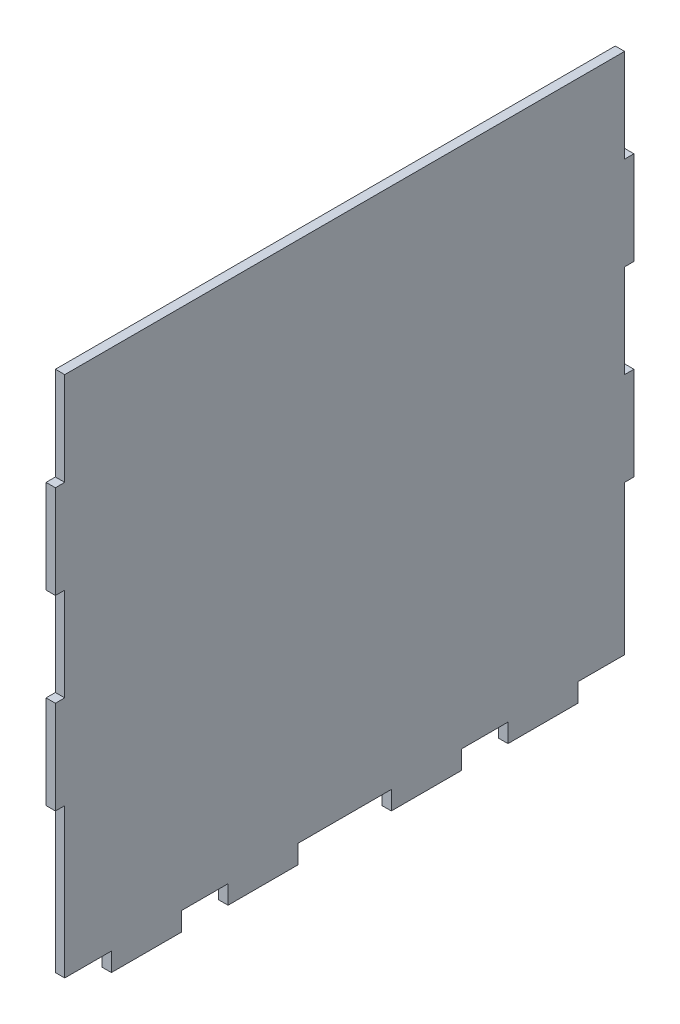
ISO-10303-21;
HEADER;
FILE_DESCRIPTION(('STEP AP214'),'2;1');
FILE_NAME('part.step','',(''),(''),'','','');
FILE_SCHEMA(('AUTOMOTIVE_DESIGN { 1 0 10303 214 1 1 1 1 }'));
ENDSEC;
DATA;
#1=APPLICATION_CONTEXT('core data for automotive mechanical design processes');
#2=APPLICATION_PROTOCOL_DEFINITION('international standard','automotive_design',2000,#1);
#3=PRODUCT_CONTEXT('',#1,'mechanical');
#4=PRODUCT('Part','Part','',(#3));
#5=PRODUCT_RELATED_PRODUCT_CATEGORY('part','',(#4));
#6=PRODUCT_DEFINITION_FORMATION('','',#4);
#7=PRODUCT_DEFINITION_CONTEXT('part definition',#1,'design');
#8=PRODUCT_DEFINITION('design','',#6,#7);
#9=PRODUCT_DEFINITION_SHAPE('','',#8);
#10=(LENGTH_UNIT() NAMED_UNIT(*) SI_UNIT(.MILLI.,.METRE.));
#11=(NAMED_UNIT(*) PLANE_ANGLE_UNIT() SI_UNIT($,.RADIAN.));
#12=(NAMED_UNIT(*) SI_UNIT($,.STERADIAN.) SOLID_ANGLE_UNIT());
#13=UNCERTAINTY_MEASURE_WITH_UNIT(LENGTH_MEASURE(1.E-05),#10,'distance_accuracy_value','');
#14=(GEOMETRIC_REPRESENTATION_CONTEXT(3) GLOBAL_UNCERTAINTY_ASSIGNED_CONTEXT((#13)) GLOBAL_UNIT_ASSIGNED_CONTEXT((#10,
#11,#12)) REPRESENTATION_CONTEXT('',''));
#15=CARTESIAN_POINT('',(0.,0.,0.));
#16=DIRECTION('',(0.,0.,1.));
#17=DIRECTION('',(1.,0.,0.));
#18=AXIS2_PLACEMENT_3D('',#15,#16,#17);
#19=CARTESIAN_POINT('',(2.,36.,-60.));
#20=DIRECTION('',(0.,0.,1.));
#21=DIRECTION('',(1.,0.,0.));
#22=AXIS2_PLACEMENT_3D('',#19,#20,#21);
#23=PLANE('',#22);
#24=DIRECTION('',(0.,1.,0.));
#25=VECTOR('',#24,1.);
#26=CARTESIAN_POINT('',(0.,36.,-60.));
#27=LINE('',#26,#25);
#28=CARTESIAN_POINT('',(0.,36.,-60.));
#29=VERTEX_POINT('',#28);
#30=CARTESIAN_POINT('',(0.,56.,-60.));
#31=VERTEX_POINT('',#30);
#32=EDGE_CURVE('E297',#29,#31,#27,.T.);
#33=ORIENTED_EDGE('',*,*,#32,.T.);
#34=DIRECTION('',(-1.,0.,0.));
#35=VECTOR('',#34,1.);
#36=CARTESIAN_POINT('',(2.,56.,-60.));
#37=LINE('',#36,#35);
#38=CARTESIAN_POINT('',(2.,56.,-60.));
#39=VERTEX_POINT('',#38);
#40=EDGE_CURVE('E11',#39,#31,#37,.T.);
#41=ORIENTED_EDGE('',*,*,#40,.F.);
#42=DIRECTION('',(0.,1.,0.));
#43=VECTOR('',#42,1.);
#44=CARTESIAN_POINT('',(2.,36.,-60.));
#45=LINE('',#44,#43);
#46=CARTESIAN_POINT('',(2.,36.,-60.));
#47=VERTEX_POINT('',#46);
#48=EDGE_CURVE('E367',#47,#39,#45,.T.);
#49=ORIENTED_EDGE('',*,*,#48,.F.);
#50=DIRECTION('',(-1.,0.,0.));
#51=VECTOR('',#50,1.);
#52=CARTESIAN_POINT('',(2.,36.,-60.));
#53=LINE('',#52,#51);
#54=EDGE_CURVE('E293',#47,#29,#53,.T.);
#55=ORIENTED_EDGE('',*,*,#54,.T.);
#56=EDGE_LOOP('',(#33,#41,#49,#55));
#57=FACE_BOUND('',#56,.T.);
#58=ADVANCED_FACE('F33',(#57),#23,.F.);
#59=CARTESIAN_POINT('',(2.,56.,60.));
#60=DIRECTION('',(0.,-1.,0.));
#61=DIRECTION('',(0.,0.,-1.));
#62=AXIS2_PLACEMENT_3D('',#59,#60,#61);
#63=PLANE('',#62);
#64=DIRECTION('',(0.,0.,1.));
#65=VECTOR('',#64,1.);
#66=CARTESIAN_POINT('',(0.,56.,60.));
#67=LINE('',#66,#65);
#68=CARTESIAN_POINT('',(0.,56.,60.));
#69=VERTEX_POINT('',#68);
#70=EDGE_CURVE('E300',#31,#69,#67,.T.);
#71=ORIENTED_EDGE('',*,*,#70,.T.);
#72=DIRECTION('',(-1.,0.,0.));
#73=VECTOR('',#72,1.);
#74=CARTESIAN_POINT('',(2.,56.,60.));
#75=LINE('',#74,#73);
#76=CARTESIAN_POINT('',(2.,56.,60.));
#77=VERTEX_POINT('',#76);
#78=EDGE_CURVE('E41',#77,#69,#75,.T.);
#79=ORIENTED_EDGE('',*,*,#78,.F.);
#80=DIRECTION('',(0.,0.,1.));
#81=VECTOR('',#80,1.);
#82=CARTESIAN_POINT('',(2.,56.,60.));
#83=LINE('',#82,#81);
#84=EDGE_CURVE('E176',#39,#77,#83,.T.);
#85=ORIENTED_EDGE('',*,*,#84,.F.);
#86=ORIENTED_EDGE('',*,*,#40,.T.);
#87=EDGE_LOOP('',(#71,#79,#85,#86));
#88=FACE_BOUND('',#87,.T.);
#89=ADVANCED_FACE('F565',(#88),#63,.F.);
#90=CARTESIAN_POINT('',(2.,36.,60.));
#91=DIRECTION('',(0.,0.,-1.));
#92=DIRECTION('',(-1.,0.,0.));
#93=AXIS2_PLACEMENT_3D('',#90,#91,#92);
#94=PLANE('',#93);
#95=DIRECTION('',(0.,-1.,0.));
#96=VECTOR('',#95,1.);
#97=CARTESIAN_POINT('',(0.,36.,60.));
#98=LINE('',#97,#96);
#99=CARTESIAN_POINT('',(0.,36.,60.));
#100=VERTEX_POINT('',#99);
#101=EDGE_CURVE('E302',#69,#100,#98,.T.);
#102=ORIENTED_EDGE('',*,*,#101,.T.);
#103=DIRECTION('',(-1.,0.,0.));
#104=VECTOR('',#103,1.);
#105=CARTESIAN_POINT('',(2.,36.,60.));
#106=LINE('',#105,#104);
#107=CARTESIAN_POINT('',(2.,36.,60.));
#108=VERTEX_POINT('',#107);
#109=EDGE_CURVE('E458',#108,#100,#106,.T.);
#110=ORIENTED_EDGE('',*,*,#109,.F.);
#111=DIRECTION('',(0.,-1.,0.));
#112=VECTOR('',#111,1.);
#113=CARTESIAN_POINT('',(2.,36.,60.));
#114=LINE('',#113,#112);
#115=EDGE_CURVE('E466',#77,#108,#114,.T.);
#116=ORIENTED_EDGE('',*,*,#115,.F.);
#117=ORIENTED_EDGE('',*,*,#78,.T.);
#118=EDGE_LOOP('',(#102,#110,#116,#117));
#119=FACE_BOUND('',#118,.T.);
#120=ADVANCED_FACE('F464',(#119),#94,.F.);
#121=CARTESIAN_POINT('',(2.,36.,60.));
#122=DIRECTION('',(0.,-1.,0.));
#123=DIRECTION('',(0.,0.,-1.));
#124=AXIS2_PLACEMENT_3D('',#121,#122,#123);
#125=PLANE('',#124);
#126=DIRECTION('',(0.,0.,1.));
#127=VECTOR('',#126,1.);
#128=CARTESIAN_POINT('',(0.,36.,60.));
#129=LINE('',#128,#127);
#130=CARTESIAN_POINT('',(0.,36.,62.));
#131=VERTEX_POINT('',#130);
#132=EDGE_CURVE('E304',#100,#131,#129,.T.);
#133=ORIENTED_EDGE('',*,*,#132,.T.);
#134=DIRECTION('',(-1.,0.,0.));
#135=VECTOR('',#134,1.);
#136=CARTESIAN_POINT('',(2.,36.,62.));
#137=LINE('',#136,#135);
#138=CARTESIAN_POINT('',(2.,36.,62.));
#139=VERTEX_POINT('',#138);
#140=EDGE_CURVE('E455',#139,#131,#137,.T.);
#141=ORIENTED_EDGE('',*,*,#140,.F.);
#142=DIRECTION('',(0.,0.,1.));
#143=VECTOR('',#142,1.);
#144=CARTESIAN_POINT('',(2.,36.,60.));
#145=LINE('',#144,#143);
#146=EDGE_CURVE('E484',#108,#139,#145,.T.);
#147=ORIENTED_EDGE('',*,*,#146,.F.);
#148=ORIENTED_EDGE('',*,*,#109,.T.);
#149=EDGE_LOOP('',(#133,#141,#147,#148));
#150=FACE_BOUND('',#149,.T.);
#151=ADVANCED_FACE('F475',(#150),#125,.F.);
#152=CARTESIAN_POINT('',(2.,36.,62.));
#153=DIRECTION('',(0.,0.,-1.));
#154=DIRECTION('',(-1.,0.,0.));
#155=AXIS2_PLACEMENT_3D('',#152,#153,#154);
#156=PLANE('',#155);
#157=DIRECTION('',(0.,-1.,0.));
#158=VECTOR('',#157,1.);
#159=CARTESIAN_POINT('',(0.,36.,62.));
#160=LINE('',#159,#158);
#161=CARTESIAN_POINT('',(0.,16.,62.));
#162=VERTEX_POINT('',#161);
#163=EDGE_CURVE('E306',#131,#162,#160,.T.);
#164=ORIENTED_EDGE('',*,*,#163,.T.);
#165=DIRECTION('',(-1.,0.,0.));
#166=VECTOR('',#165,1.);
#167=CARTESIAN_POINT('',(2.,16.,62.));
#168=LINE('',#167,#166);
#169=CARTESIAN_POINT('',(2.,16.,62.));
#170=VERTEX_POINT('',#169);
#171=EDGE_CURVE('E452',#170,#162,#168,.T.);
#172=ORIENTED_EDGE('',*,*,#171,.F.);
#173=DIRECTION('',(0.,-1.,0.));
#174=VECTOR('',#173,1.);
#175=CARTESIAN_POINT('',(2.,36.,62.));
#176=LINE('',#175,#174);
#177=EDGE_CURVE('E481',#139,#170,#176,.T.);
#178=ORIENTED_EDGE('',*,*,#177,.F.);
#179=ORIENTED_EDGE('',*,*,#140,.T.);
#180=EDGE_LOOP('',(#164,#172,#178,#179));
#181=FACE_BOUND('',#180,.T.);
#182=ADVANCED_FACE('F479',(#181),#156,.F.);
#183=CARTESIAN_POINT('',(2.,16.,60.));
#184=DIRECTION('',(0.,1.,0.));
#185=DIRECTION('',(0.,0.,1.));
#186=AXIS2_PLACEMENT_3D('',#183,#184,#185);
#187=PLANE('',#186);
#188=DIRECTION('',(0.,0.,-1.));
#189=VECTOR('',#188,1.);
#190=CARTESIAN_POINT('',(0.,16.,60.));
#191=LINE('',#190,#189);
#192=CARTESIAN_POINT('',(0.,16.,60.));
#193=VERTEX_POINT('',#192);
#194=EDGE_CURVE('E308',#162,#193,#191,.T.);
#195=ORIENTED_EDGE('',*,*,#194,.T.);
#196=DIRECTION('',(-1.,0.,0.));
#197=VECTOR('',#196,1.);
#198=CARTESIAN_POINT('',(2.,16.,60.));
#199=LINE('',#198,#197);
#200=CARTESIAN_POINT('',(2.,16.,60.));
#201=VERTEX_POINT('',#200);
#202=EDGE_CURVE('E449',#201,#193,#199,.T.);
#203=ORIENTED_EDGE('',*,*,#202,.F.);
#204=DIRECTION('',(0.,0.,-1.));
#205=VECTOR('',#204,1.);
#206=CARTESIAN_POINT('',(2.,16.,60.));
#207=LINE('',#206,#205);
#208=EDGE_CURVE('E483',#170,#201,#207,.T.);
#209=ORIENTED_EDGE('',*,*,#208,.F.);
#210=ORIENTED_EDGE('',*,*,#171,.T.);
#211=EDGE_LOOP('',(#195,#203,#209,#210));
#212=FACE_BOUND('',#211,.T.);
#213=ADVANCED_FACE('F578',(#212),#187,.F.);
#214=CARTESIAN_POINT('',(2.,-4.,60.));
#215=DIRECTION('',(0.,0.,-1.));
#216=DIRECTION('',(-1.,0.,0.));
#217=AXIS2_PLACEMENT_3D('',#214,#215,#216);
#218=PLANE('',#217);
#219=DIRECTION('',(0.,-1.,0.));
#220=VECTOR('',#219,1.);
#221=CARTESIAN_POINT('',(0.,-4.,60.));
#222=LINE('',#221,#220);
#223=CARTESIAN_POINT('',(0.,-4.,60.));
#224=VERTEX_POINT('',#223);
#225=EDGE_CURVE('E310',#193,#224,#222,.T.);
#226=ORIENTED_EDGE('',*,*,#225,.T.);
#227=DIRECTION('',(-1.,0.,0.));
#228=VECTOR('',#227,1.);
#229=CARTESIAN_POINT('',(2.,-4.,60.));
#230=LINE('',#229,#228);
#231=CARTESIAN_POINT('',(2.,-4.,60.));
#232=VERTEX_POINT('',#231);
#233=EDGE_CURVE('E446',#232,#224,#230,.T.);
#234=ORIENTED_EDGE('',*,*,#233,.F.);
#235=DIRECTION('',(0.,-1.,0.));
#236=VECTOR('',#235,1.);
#237=CARTESIAN_POINT('',(2.,-4.,60.));
#238=LINE('',#237,#236);
#239=EDGE_CURVE('E486',#201,#232,#238,.T.);
#240=ORIENTED_EDGE('',*,*,#239,.F.);
#241=ORIENTED_EDGE('',*,*,#202,.T.);
#242=EDGE_LOOP('',(#226,#234,#240,#241));
#243=FACE_BOUND('',#242,.T.);
#244=ADVANCED_FACE('F581',(#243),#218,.F.);
#245=CARTESIAN_POINT('',(2.,-4.,60.));
#246=DIRECTION('',(0.,-1.,0.));
#247=DIRECTION('',(0.,0.,-1.));
#248=AXIS2_PLACEMENT_3D('',#245,#246,#247);
#249=PLANE('',#248);
#250=DIRECTION('',(0.,0.,1.));
#251=VECTOR('',#250,1.);
#252=CARTESIAN_POINT('',(0.,-4.,60.));
#253=LINE('',#252,#251);
#254=CARTESIAN_POINT('',(0.,-4.,62.));
#255=VERTEX_POINT('',#254);
#256=EDGE_CURVE('E312',#224,#255,#253,.T.);
#257=ORIENTED_EDGE('',*,*,#256,.T.);
#258=DIRECTION('',(-1.,0.,0.));
#259=VECTOR('',#258,1.);
#260=CARTESIAN_POINT('',(2.,-4.,62.));
#261=LINE('',#260,#259);
#262=CARTESIAN_POINT('',(2.,-4.,62.));
#263=VERTEX_POINT('',#262);
#264=EDGE_CURVE('E443',#263,#255,#261,.T.);
#265=ORIENTED_EDGE('',*,*,#264,.F.);
#266=DIRECTION('',(0.,0.,1.));
#267=VECTOR('',#266,1.);
#268=CARTESIAN_POINT('',(2.,-4.,60.));
#269=LINE('',#268,#267);
#270=EDGE_CURVE('E492',#232,#263,#269,.T.);
#271=ORIENTED_EDGE('',*,*,#270,.F.);
#272=ORIENTED_EDGE('',*,*,#233,.T.);
#273=EDGE_LOOP('',(#257,#265,#271,#272));
#274=FACE_BOUND('',#273,.T.);
#275=ADVANCED_FACE('F585',(#274),#249,.F.);
#276=CARTESIAN_POINT('',(2.,-4.,62.));
#277=DIRECTION('',(0.,0.,-1.));
#278=DIRECTION('',(0.,1.,0.));
#279=AXIS2_PLACEMENT_3D('',#276,#277,#278);
#280=PLANE('',#279);
#281=DIRECTION('',(0.,-1.,0.));
#282=VECTOR('',#281,1.);
#283=CARTESIAN_POINT('',(0.,-4.,62.));
#284=LINE('',#283,#282);
#285=CARTESIAN_POINT('',(0.,-24.,62.));
#286=VERTEX_POINT('',#285);
#287=EDGE_CURVE('E314',#255,#286,#284,.T.);
#288=ORIENTED_EDGE('',*,*,#287,.T.);
#289=DIRECTION('',(-1.,0.,0.));
#290=VECTOR('',#289,1.);
#291=CARTESIAN_POINT('',(2.,-24.,62.));
#292=LINE('',#291,#290);
#293=CARTESIAN_POINT('',(2.,-24.,62.));
#294=VERTEX_POINT('',#293);
#295=EDGE_CURVE('E440',#294,#286,#292,.T.);
#296=ORIENTED_EDGE('',*,*,#295,.F.);
#297=DIRECTION('',(0.,-1.,0.));
#298=VECTOR('',#297,1.);
#299=CARTESIAN_POINT('',(2.,-4.,62.));
#300=LINE('',#299,#298);
#301=EDGE_CURVE('E494',#263,#294,#300,.T.);
#302=ORIENTED_EDGE('',*,*,#301,.F.);
#303=ORIENTED_EDGE('',*,*,#264,.T.);
#304=EDGE_LOOP('',(#288,#296,#302,#303));
#305=FACE_BOUND('',#304,.T.);
#306=ADVANCED_FACE('F589',(#305),#280,.F.);
#307=CARTESIAN_POINT('',(2.,-24.,60.));
#308=DIRECTION('',(0.,1.,0.));
#309=DIRECTION('',(0.,0.,1.));
#310=AXIS2_PLACEMENT_3D('',#307,#308,#309);
#311=PLANE('',#310);
#312=DIRECTION('',(0.,0.,-1.));
#313=VECTOR('',#312,1.);
#314=CARTESIAN_POINT('',(0.,-24.,60.));
#315=LINE('',#314,#313);
#316=CARTESIAN_POINT('',(0.,-24.,60.));
#317=VERTEX_POINT('',#316);
#318=EDGE_CURVE('E316',#286,#317,#315,.T.);
#319=ORIENTED_EDGE('',*,*,#318,.T.);
#320=DIRECTION('',(-1.,0.,0.));
#321=VECTOR('',#320,1.);
#322=CARTESIAN_POINT('',(2.,-24.,60.));
#323=LINE('',#322,#321);
#324=CARTESIAN_POINT('',(2.,-24.,60.));
#325=VERTEX_POINT('',#324);
#326=EDGE_CURVE('E437',#325,#317,#323,.T.);
#327=ORIENTED_EDGE('',*,*,#326,.F.);
#328=DIRECTION('',(0.,0.,-1.));
#329=VECTOR('',#328,1.);
#330=CARTESIAN_POINT('',(2.,-24.,60.));
#331=LINE('',#330,#329);
#332=EDGE_CURVE('E496',#294,#325,#331,.T.);
#333=ORIENTED_EDGE('',*,*,#332,.F.);
#334=ORIENTED_EDGE('',*,*,#295,.T.);
#335=EDGE_LOOP('',(#319,#327,#333,#334));
#336=FACE_BOUND('',#335,.T.);
#337=ADVANCED_FACE('F593',(#336),#311,.F.);
#338=CARTESIAN_POINT('',(2.,-56.,60.));
#339=DIRECTION('',(0.,0.,-1.));
#340=DIRECTION('',(-1.,0.,0.));
#341=AXIS2_PLACEMENT_3D('',#338,#339,#340);
#342=PLANE('',#341);
#343=DIRECTION('',(0.,-1.,0.));
#344=VECTOR('',#343,1.);
#345=CARTESIAN_POINT('',(0.,-56.,60.));
#346=LINE('',#345,#344);
#347=CARTESIAN_POINT('',(0.,-56.,60.));
#348=VERTEX_POINT('',#347);
#349=EDGE_CURVE('E318',#317,#348,#346,.T.);
#350=ORIENTED_EDGE('',*,*,#349,.T.);
#351=DIRECTION('',(-1.,0.,0.));
#352=VECTOR('',#351,1.);
#353=CARTESIAN_POINT('',(2.,-56.,60.));
#354=LINE('',#353,#352);
#355=CARTESIAN_POINT('',(2.,-56.,60.));
#356=VERTEX_POINT('',#355);
#357=EDGE_CURVE('E434',#356,#348,#354,.T.);
#358=ORIENTED_EDGE('',*,*,#357,.F.);
#359=DIRECTION('',(0.,-1.,0.));
#360=VECTOR('',#359,1.);
#361=CARTESIAN_POINT('',(2.,-56.,60.));
#362=LINE('',#361,#360);
#363=EDGE_CURVE('E498',#325,#356,#362,.T.);
#364=ORIENTED_EDGE('',*,*,#363,.F.);
#365=ORIENTED_EDGE('',*,*,#326,.T.);
#366=EDGE_LOOP('',(#350,#358,#364,#365));
#367=FACE_BOUND('',#366,.T.);
#368=ADVANCED_FACE('F597',(#367),#342,.F.);
#369=CARTESIAN_POINT('',(2.,-56.,60.));
#370=DIRECTION('',(0.,1.,0.));
#371=DIRECTION('',(0.,0.,1.));
#372=AXIS2_PLACEMENT_3D('',#369,#370,#371);
#373=PLANE('',#372);
#374=DIRECTION('',(0.,0.,-1.));
#375=VECTOR('',#374,1.);
#376=CARTESIAN_POINT('',(0.,-56.,60.));
#377=LINE('',#376,#375);
#378=CARTESIAN_POINT('',(0.,-56.,50.));
#379=VERTEX_POINT('',#378);
#380=EDGE_CURVE('E320',#348,#379,#377,.T.);
#381=ORIENTED_EDGE('',*,*,#380,.T.);
#382=DIRECTION('',(-1.,0.,0.));
#383=VECTOR('',#382,1.);
#384=CARTESIAN_POINT('',(2.,-56.,50.));
#385=LINE('',#384,#383);
#386=CARTESIAN_POINT('',(2.,-56.,50.));
#387=VERTEX_POINT('',#386);
#388=EDGE_CURVE('E431',#387,#379,#385,.T.);
#389=ORIENTED_EDGE('',*,*,#388,.F.);
#390=DIRECTION('',(0.,0.,-1.));
#391=VECTOR('',#390,1.);
#392=CARTESIAN_POINT('',(2.,-56.,60.));
#393=LINE('',#392,#391);
#394=EDGE_CURVE('E500',#356,#387,#393,.T.);
#395=ORIENTED_EDGE('',*,*,#394,.F.);
#396=ORIENTED_EDGE('',*,*,#357,.T.);
#397=EDGE_LOOP('',(#381,#389,#395,#396));
#398=FACE_BOUND('',#397,.T.);
#399=ADVANCED_FACE('F601',(#398),#373,.F.);
#400=CARTESIAN_POINT('',(2.,-56.,50.));
#401=DIRECTION('',(0.,0.,-1.));
#402=DIRECTION('',(-1.,0.,0.));
#403=AXIS2_PLACEMENT_3D('',#400,#401,#402);
#404=PLANE('',#403);
#405=DIRECTION('',(0.,-1.,0.));
#406=VECTOR('',#405,1.);
#407=CARTESIAN_POINT('',(0.,-56.,50.));
#408=LINE('',#407,#406);
#409=CARTESIAN_POINT('',(0.,-60.,50.));
#410=VERTEX_POINT('',#409);
#411=EDGE_CURVE('E322',#379,#410,#408,.T.);
#412=ORIENTED_EDGE('',*,*,#411,.T.);
#413=DIRECTION('',(-1.,0.,0.));
#414=VECTOR('',#413,1.);
#415=CARTESIAN_POINT('',(2.,-60.,50.));
#416=LINE('',#415,#414);
#417=CARTESIAN_POINT('',(2.,-60.,50.));
#418=VERTEX_POINT('',#417);
#419=EDGE_CURVE('E428',#418,#410,#416,.T.);
#420=ORIENTED_EDGE('',*,*,#419,.F.);
#421=DIRECTION('',(0.,-1.,0.));
#422=VECTOR('',#421,1.);
#423=CARTESIAN_POINT('',(2.,-56.,50.));
#424=LINE('',#423,#422);
#425=EDGE_CURVE('E502',#387,#418,#424,.T.);
#426=ORIENTED_EDGE('',*,*,#425,.F.);
#427=ORIENTED_EDGE('',*,*,#388,.T.);
#428=EDGE_LOOP('',(#412,#420,#426,#427));
#429=FACE_BOUND('',#428,.T.);
#430=ADVANCED_FACE('F605',(#429),#404,.F.);
#431=CARTESIAN_POINT('',(2.,-60.,50.));
#432=DIRECTION('',(0.,1.,0.));
#433=DIRECTION('',(0.,0.,1.));
#434=AXIS2_PLACEMENT_3D('',#431,#432,#433);
#435=PLANE('',#434);
#436=DIRECTION('',(0.,0.,-1.));
#437=VECTOR('',#436,1.);
#438=CARTESIAN_POINT('',(0.,-60.,50.));
#439=LINE('',#438,#437);
#440=CARTESIAN_POINT('',(0.,-60.,35.));
#441=VERTEX_POINT('',#440);
#442=EDGE_CURVE('E324',#410,#441,#439,.T.);
#443=ORIENTED_EDGE('',*,*,#442,.T.);
#444=DIRECTION('',(-1.,0.,0.));
#445=VECTOR('',#444,1.);
#446=CARTESIAN_POINT('',(2.,-60.,35.));
#447=LINE('',#446,#445);
#448=CARTESIAN_POINT('',(2.,-60.,35.));
#449=VERTEX_POINT('',#448);
#450=EDGE_CURVE('E425',#449,#441,#447,.T.);
#451=ORIENTED_EDGE('',*,*,#450,.F.);
#452=DIRECTION('',(0.,0.,-1.));
#453=VECTOR('',#452,1.);
#454=CARTESIAN_POINT('',(2.,-60.,50.));
#455=LINE('',#454,#453);
#456=EDGE_CURVE('E504',#418,#449,#455,.T.);
#457=ORIENTED_EDGE('',*,*,#456,.F.);
#458=ORIENTED_EDGE('',*,*,#419,.T.);
#459=EDGE_LOOP('',(#443,#451,#457,#458));
#460=FACE_BOUND('',#459,.T.);
#461=ADVANCED_FACE('F609',(#460),#435,.F.);
#462=CARTESIAN_POINT('',(2.,-56.,35.));
#463=DIRECTION('',(0.,0.,1.));
#464=DIRECTION('',(1.,0.,0.));
#465=AXIS2_PLACEMENT_3D('',#462,#463,#464);
#466=PLANE('',#465);
#467=DIRECTION('',(0.,1.,0.));
#468=VECTOR('',#467,1.);
#469=CARTESIAN_POINT('',(0.,-56.,35.));
#470=LINE('',#469,#468);
#471=CARTESIAN_POINT('',(0.,-56.,35.));
#472=VERTEX_POINT('',#471);
#473=EDGE_CURVE('E326',#441,#472,#470,.T.);
#474=ORIENTED_EDGE('',*,*,#473,.T.);
#475=DIRECTION('',(-1.,0.,0.));
#476=VECTOR('',#475,1.);
#477=CARTESIAN_POINT('',(2.,-56.,35.));
#478=LINE('',#477,#476);
#479=CARTESIAN_POINT('',(2.,-56.,35.));
#480=VERTEX_POINT('',#479);
#481=EDGE_CURVE('E422',#480,#472,#478,.T.);
#482=ORIENTED_EDGE('',*,*,#481,.F.);
#483=DIRECTION('',(0.,1.,0.));
#484=VECTOR('',#483,1.);
#485=CARTESIAN_POINT('',(2.,-56.,35.));
#486=LINE('',#485,#484);
#487=EDGE_CURVE('E506',#449,#480,#486,.T.);
#488=ORIENTED_EDGE('',*,*,#487,.F.);
#489=ORIENTED_EDGE('',*,*,#450,.T.);
#490=EDGE_LOOP('',(#474,#482,#488,#489));
#491=FACE_BOUND('',#490,.T.);
#492=ADVANCED_FACE('F613',(#491),#466,.F.);
#493=CARTESIAN_POINT('',(2.,-56.,35.));
#494=DIRECTION('',(0.,1.,0.));
#495=DIRECTION('',(0.,0.,1.));
#496=AXIS2_PLACEMENT_3D('',#493,#494,#495);
#497=PLANE('',#496);
#498=DIRECTION('',(0.,0.,-1.));
#499=VECTOR('',#498,1.);
#500=CARTESIAN_POINT('',(0.,-56.,35.));
#501=LINE('',#500,#499);
#502=CARTESIAN_POINT('',(0.,-56.,25.));
#503=VERTEX_POINT('',#502);
#504=EDGE_CURVE('E328',#472,#503,#501,.T.);
#505=ORIENTED_EDGE('',*,*,#504,.T.);
#506=DIRECTION('',(-1.,0.,0.));
#507=VECTOR('',#506,1.);
#508=CARTESIAN_POINT('',(2.,-56.,25.));
#509=LINE('',#508,#507);
#510=CARTESIAN_POINT('',(2.,-56.,25.));
#511=VERTEX_POINT('',#510);
#512=EDGE_CURVE('E419',#511,#503,#509,.T.);
#513=ORIENTED_EDGE('',*,*,#512,.F.);
#514=DIRECTION('',(0.,0.,-1.));
#515=VECTOR('',#514,1.);
#516=CARTESIAN_POINT('',(2.,-56.,35.));
#517=LINE('',#516,#515);
#518=EDGE_CURVE('E508',#480,#511,#517,.T.);
#519=ORIENTED_EDGE('',*,*,#518,.F.);
#520=ORIENTED_EDGE('',*,*,#481,.T.);
#521=EDGE_LOOP('',(#505,#513,#519,#520));
#522=FACE_BOUND('',#521,.T.);
#523=ADVANCED_FACE('F617',(#522),#497,.F.);
#524=CARTESIAN_POINT('',(2.,-56.,25.));
#525=DIRECTION('',(0.,0.,-1.));
#526=DIRECTION('',(-1.,0.,0.));
#527=AXIS2_PLACEMENT_3D('',#524,#525,#526);
#528=PLANE('',#527);
#529=DIRECTION('',(0.,-1.,0.));
#530=VECTOR('',#529,1.);
#531=CARTESIAN_POINT('',(0.,-56.,25.));
#532=LINE('',#531,#530);
#533=CARTESIAN_POINT('',(0.,-60.,25.));
#534=VERTEX_POINT('',#533);
#535=EDGE_CURVE('E330',#503,#534,#532,.T.);
#536=ORIENTED_EDGE('',*,*,#535,.T.);
#537=DIRECTION('',(-1.,0.,0.));
#538=VECTOR('',#537,1.);
#539=CARTESIAN_POINT('',(2.,-60.,25.));
#540=LINE('',#539,#538);
#541=CARTESIAN_POINT('',(2.,-60.,25.));
#542=VERTEX_POINT('',#541);
#543=EDGE_CURVE('E416',#542,#534,#540,.T.);
#544=ORIENTED_EDGE('',*,*,#543,.F.);
#545=DIRECTION('',(0.,-1.,0.));
#546=VECTOR('',#545,1.);
#547=CARTESIAN_POINT('',(2.,-56.,25.));
#548=LINE('',#547,#546);
#549=EDGE_CURVE('E510',#511,#542,#548,.T.);
#550=ORIENTED_EDGE('',*,*,#549,.F.);
#551=ORIENTED_EDGE('',*,*,#512,.T.);
#552=EDGE_LOOP('',(#536,#544,#550,#551));
#553=FACE_BOUND('',#552,.T.);
#554=ADVANCED_FACE('F621',(#553),#528,.F.);
#555=CARTESIAN_POINT('',(2.,-60.,25.));
#556=DIRECTION('',(0.,1.,0.));
#557=DIRECTION('',(0.,0.,1.));
#558=AXIS2_PLACEMENT_3D('',#555,#556,#557);
#559=PLANE('',#558);
#560=DIRECTION('',(0.,0.,-1.));
#561=VECTOR('',#560,1.);
#562=CARTESIAN_POINT('',(0.,-60.,25.));
#563=LINE('',#562,#561);
#564=CARTESIAN_POINT('',(0.,-60.,9.99999999999999));
#565=VERTEX_POINT('',#564);
#566=EDGE_CURVE('E332',#534,#565,#563,.T.);
#567=ORIENTED_EDGE('',*,*,#566,.T.);
#568=DIRECTION('',(-1.,0.,0.));
#569=VECTOR('',#568,1.);
#570=CARTESIAN_POINT('',(2.,-60.,9.99999999999999));
#571=LINE('',#570,#569);
#572=CARTESIAN_POINT('',(2.,-60.,9.99999999999999));
#573=VERTEX_POINT('',#572);
#574=EDGE_CURVE('E413',#573,#565,#571,.T.);
#575=ORIENTED_EDGE('',*,*,#574,.F.);
#576=DIRECTION('',(0.,0.,-1.));
#577=VECTOR('',#576,1.);
#578=CARTESIAN_POINT('',(2.,-60.,25.));
#579=LINE('',#578,#577);
#580=EDGE_CURVE('E512',#542,#573,#579,.T.);
#581=ORIENTED_EDGE('',*,*,#580,.F.);
#582=ORIENTED_EDGE('',*,*,#543,.T.);
#583=EDGE_LOOP('',(#567,#575,#581,#582));
#584=FACE_BOUND('',#583,.T.);
#585=ADVANCED_FACE('F625',(#584),#559,.F.);
#586=CARTESIAN_POINT('',(2.,-56.,9.99999999999999));
#587=DIRECTION('',(0.,0.,1.));
#588=DIRECTION('',(1.,0.,0.));
#589=AXIS2_PLACEMENT_3D('',#586,#587,#588);
#590=PLANE('',#589);
#591=DIRECTION('',(0.,1.,0.));
#592=VECTOR('',#591,1.);
#593=CARTESIAN_POINT('',(0.,-56.,9.99999999999999));
#594=LINE('',#593,#592);
#595=CARTESIAN_POINT('',(0.,-56.,9.99999999999999));
#596=VERTEX_POINT('',#595);
#597=EDGE_CURVE('E334',#565,#596,#594,.T.);
#598=ORIENTED_EDGE('',*,*,#597,.T.);
#599=DIRECTION('',(-1.,0.,0.));
#600=VECTOR('',#599,1.);
#601=CARTESIAN_POINT('',(2.,-56.,9.99999999999999));
#602=LINE('',#601,#600);
#603=CARTESIAN_POINT('',(2.,-56.,9.99999999999999));
#604=VERTEX_POINT('',#603);
#605=EDGE_CURVE('E410',#604,#596,#602,.T.);
#606=ORIENTED_EDGE('',*,*,#605,.F.);
#607=DIRECTION('',(0.,1.,0.));
#608=VECTOR('',#607,1.);
#609=CARTESIAN_POINT('',(2.,-56.,9.99999999999999));
#610=LINE('',#609,#608);
#611=EDGE_CURVE('E514',#573,#604,#610,.T.);
#612=ORIENTED_EDGE('',*,*,#611,.F.);
#613=ORIENTED_EDGE('',*,*,#574,.T.);
#614=EDGE_LOOP('',(#598,#606,#612,#613));
#615=FACE_BOUND('',#614,.T.);
#616=ADVANCED_FACE('F629',(#615),#590,.F.);
#617=CARTESIAN_POINT('',(2.,-56.,9.99999999999999));
#618=DIRECTION('',(0.,1.,0.));
#619=DIRECTION('',(0.,0.,1.));
#620=AXIS2_PLACEMENT_3D('',#617,#618,#619);
#621=PLANE('',#620);
#622=DIRECTION('',(0.,0.,-1.));
#623=VECTOR('',#622,1.);
#624=CARTESIAN_POINT('',(0.,-56.,9.99999999999999));
#625=LINE('',#624,#623);
#626=CARTESIAN_POINT('',(0.,-56.,-9.99999999999999));
#627=VERTEX_POINT('',#626);
#628=EDGE_CURVE('E336',#596,#627,#625,.T.);
#629=ORIENTED_EDGE('',*,*,#628,.T.);
#630=DIRECTION('',(-1.,0.,0.));
#631=VECTOR('',#630,1.);
#632=CARTESIAN_POINT('',(2.,-56.,-9.99999999999999));
#633=LINE('',#632,#631);
#634=CARTESIAN_POINT('',(2.,-56.,-9.99999999999999));
#635=VERTEX_POINT('',#634);
#636=EDGE_CURVE('E407',#635,#627,#633,.T.);
#637=ORIENTED_EDGE('',*,*,#636,.F.);
#638=DIRECTION('',(0.,0.,-1.));
#639=VECTOR('',#638,1.);
#640=CARTESIAN_POINT('',(2.,-56.,9.99999999999999));
#641=LINE('',#640,#639);
#642=EDGE_CURVE('E516',#604,#635,#641,.T.);
#643=ORIENTED_EDGE('',*,*,#642,.F.);
#644=ORIENTED_EDGE('',*,*,#605,.T.);
#645=EDGE_LOOP('',(#629,#637,#643,#644));
#646=FACE_BOUND('',#645,.T.);
#647=ADVANCED_FACE('F633',(#646),#621,.F.);
#648=CARTESIAN_POINT('',(2.,-56.,-9.99999999999999));
#649=DIRECTION('',(0.,0.,-1.));
#650=DIRECTION('',(-1.,0.,0.));
#651=AXIS2_PLACEMENT_3D('',#648,#649,#650);
#652=PLANE('',#651);
#653=DIRECTION('',(0.,-1.,0.));
#654=VECTOR('',#653,1.);
#655=CARTESIAN_POINT('',(0.,-56.,-9.99999999999999));
#656=LINE('',#655,#654);
#657=CARTESIAN_POINT('',(0.,-60.,-9.99999999999999));
#658=VERTEX_POINT('',#657);
#659=EDGE_CURVE('E338',#627,#658,#656,.T.);
#660=ORIENTED_EDGE('',*,*,#659,.T.);
#661=DIRECTION('',(-1.,0.,0.));
#662=VECTOR('',#661,1.);
#663=CARTESIAN_POINT('',(2.,-60.,-9.99999999999999));
#664=LINE('',#663,#662);
#665=CARTESIAN_POINT('',(2.,-60.,-9.99999999999999));
#666=VERTEX_POINT('',#665);
#667=EDGE_CURVE('E404',#666,#658,#664,.T.);
#668=ORIENTED_EDGE('',*,*,#667,.F.);
#669=DIRECTION('',(0.,-1.,0.));
#670=VECTOR('',#669,1.);
#671=CARTESIAN_POINT('',(2.,-56.,-9.99999999999999));
#672=LINE('',#671,#670);
#673=EDGE_CURVE('E518',#635,#666,#672,.T.);
#674=ORIENTED_EDGE('',*,*,#673,.F.);
#675=ORIENTED_EDGE('',*,*,#636,.T.);
#676=EDGE_LOOP('',(#660,#668,#674,#675));
#677=FACE_BOUND('',#676,.T.);
#678=ADVANCED_FACE('F637',(#677),#652,.F.);
#679=CARTESIAN_POINT('',(2.,-60.,-25.));
#680=DIRECTION('',(0.,1.,0.));
#681=DIRECTION('',(0.,0.,1.));
#682=AXIS2_PLACEMENT_3D('',#679,#680,#681);
#683=PLANE('',#682);
#684=DIRECTION('',(0.,0.,-1.));
#685=VECTOR('',#684,1.);
#686=CARTESIAN_POINT('',(0.,-60.,-25.));
#687=LINE('',#686,#685);
#688=CARTESIAN_POINT('',(0.,-60.,-25.));
#689=VERTEX_POINT('',#688);
#690=EDGE_CURVE('E340',#658,#689,#687,.T.);
#691=ORIENTED_EDGE('',*,*,#690,.T.);
#692=DIRECTION('',(-1.,0.,0.));
#693=VECTOR('',#692,1.);
#694=CARTESIAN_POINT('',(2.,-60.,-25.));
#695=LINE('',#694,#693);
#696=CARTESIAN_POINT('',(2.,-60.,-25.));
#697=VERTEX_POINT('',#696);
#698=EDGE_CURVE('E401',#697,#689,#695,.T.);
#699=ORIENTED_EDGE('',*,*,#698,.F.);
#700=DIRECTION('',(0.,0.,-1.));
#701=VECTOR('',#700,1.);
#702=CARTESIAN_POINT('',(2.,-60.,-25.));
#703=LINE('',#702,#701);
#704=EDGE_CURVE('E520',#666,#697,#703,.T.);
#705=ORIENTED_EDGE('',*,*,#704,.F.);
#706=ORIENTED_EDGE('',*,*,#667,.T.);
#707=EDGE_LOOP('',(#691,#699,#705,#706));
#708=FACE_BOUND('',#707,.T.);
#709=ADVANCED_FACE('F641',(#708),#683,.F.);
#710=CARTESIAN_POINT('',(2.,-56.,-25.));
#711=DIRECTION('',(0.,0.,1.));
#712=DIRECTION('',(1.,0.,0.));
#713=AXIS2_PLACEMENT_3D('',#710,#711,#712);
#714=PLANE('',#713);
#715=DIRECTION('',(0.,1.,0.));
#716=VECTOR('',#715,1.);
#717=CARTESIAN_POINT('',(0.,-56.,-25.));
#718=LINE('',#717,#716);
#719=CARTESIAN_POINT('',(0.,-56.,-25.));
#720=VERTEX_POINT('',#719);
#721=EDGE_CURVE('E342',#689,#720,#718,.T.);
#722=ORIENTED_EDGE('',*,*,#721,.T.);
#723=DIRECTION('',(-1.,0.,0.));
#724=VECTOR('',#723,1.);
#725=CARTESIAN_POINT('',(2.,-56.,-25.));
#726=LINE('',#725,#724);
#727=CARTESIAN_POINT('',(2.,-56.,-25.));
#728=VERTEX_POINT('',#727);
#729=EDGE_CURVE('E398',#728,#720,#726,.T.);
#730=ORIENTED_EDGE('',*,*,#729,.F.);
#731=DIRECTION('',(0.,1.,0.));
#732=VECTOR('',#731,1.);
#733=CARTESIAN_POINT('',(2.,-56.,-25.));
#734=LINE('',#733,#732);
#735=EDGE_CURVE('E522',#697,#728,#734,.T.);
#736=ORIENTED_EDGE('',*,*,#735,.F.);
#737=ORIENTED_EDGE('',*,*,#698,.T.);
#738=EDGE_LOOP('',(#722,#730,#736,#737));
#739=FACE_BOUND('',#738,.T.);
#740=ADVANCED_FACE('F645',(#739),#714,.F.);
#741=CARTESIAN_POINT('',(2.,-56.,-25.));
#742=DIRECTION('',(0.,1.,0.));
#743=DIRECTION('',(0.,0.,1.));
#744=AXIS2_PLACEMENT_3D('',#741,#742,#743);
#745=PLANE('',#744);
#746=DIRECTION('',(0.,0.,-1.));
#747=VECTOR('',#746,1.);
#748=CARTESIAN_POINT('',(0.,-56.,-25.));
#749=LINE('',#748,#747);
#750=CARTESIAN_POINT('',(0.,-56.,-35.));
#751=VERTEX_POINT('',#750);
#752=EDGE_CURVE('E344',#720,#751,#749,.T.);
#753=ORIENTED_EDGE('',*,*,#752,.T.);
#754=DIRECTION('',(-1.,0.,0.));
#755=VECTOR('',#754,1.);
#756=CARTESIAN_POINT('',(2.,-56.,-35.));
#757=LINE('',#756,#755);
#758=CARTESIAN_POINT('',(2.,-56.,-35.));
#759=VERTEX_POINT('',#758);
#760=EDGE_CURVE('E395',#759,#751,#757,.T.);
#761=ORIENTED_EDGE('',*,*,#760,.F.);
#762=DIRECTION('',(0.,0.,-1.));
#763=VECTOR('',#762,1.);
#764=CARTESIAN_POINT('',(2.,-56.,-25.));
#765=LINE('',#764,#763);
#766=EDGE_CURVE('E524',#728,#759,#765,.T.);
#767=ORIENTED_EDGE('',*,*,#766,.F.);
#768=ORIENTED_EDGE('',*,*,#729,.T.);
#769=EDGE_LOOP('',(#753,#761,#767,#768));
#770=FACE_BOUND('',#769,.T.);
#771=ADVANCED_FACE('F649',(#770),#745,.F.);
#772=CARTESIAN_POINT('',(2.,-56.,-35.));
#773=DIRECTION('',(0.,0.,-1.));
#774=DIRECTION('',(-1.,0.,0.));
#775=AXIS2_PLACEMENT_3D('',#772,#773,#774);
#776=PLANE('',#775);
#777=DIRECTION('',(0.,-1.,0.));
#778=VECTOR('',#777,1.);
#779=CARTESIAN_POINT('',(0.,-56.,-35.));
#780=LINE('',#779,#778);
#781=CARTESIAN_POINT('',(0.,-60.,-35.));
#782=VERTEX_POINT('',#781);
#783=EDGE_CURVE('E346',#751,#782,#780,.T.);
#784=ORIENTED_EDGE('',*,*,#783,.T.);
#785=DIRECTION('',(-1.,0.,0.));
#786=VECTOR('',#785,1.);
#787=CARTESIAN_POINT('',(2.,-60.,-35.));
#788=LINE('',#787,#786);
#789=CARTESIAN_POINT('',(2.,-60.,-35.));
#790=VERTEX_POINT('',#789);
#791=EDGE_CURVE('E392',#790,#782,#788,.T.);
#792=ORIENTED_EDGE('',*,*,#791,.F.);
#793=DIRECTION('',(0.,-1.,0.));
#794=VECTOR('',#793,1.);
#795=CARTESIAN_POINT('',(2.,-56.,-35.));
#796=LINE('',#795,#794);
#797=EDGE_CURVE('E526',#759,#790,#796,.T.);
#798=ORIENTED_EDGE('',*,*,#797,.F.);
#799=ORIENTED_EDGE('',*,*,#760,.T.);
#800=EDGE_LOOP('',(#784,#792,#798,#799));
#801=FACE_BOUND('',#800,.T.);
#802=ADVANCED_FACE('F653',(#801),#776,.F.);
#803=CARTESIAN_POINT('',(2.,-60.,-50.));
#804=DIRECTION('',(0.,1.,0.));
#805=DIRECTION('',(0.,0.,1.));
#806=AXIS2_PLACEMENT_3D('',#803,#804,#805);
#807=PLANE('',#806);
#808=DIRECTION('',(0.,0.,-1.));
#809=VECTOR('',#808,1.);
#810=CARTESIAN_POINT('',(0.,-60.,-50.));
#811=LINE('',#810,#809);
#812=CARTESIAN_POINT('',(0.,-60.,-50.));
#813=VERTEX_POINT('',#812);
#814=EDGE_CURVE('E348',#782,#813,#811,.T.);
#815=ORIENTED_EDGE('',*,*,#814,.T.);
#816=DIRECTION('',(-1.,0.,0.));
#817=VECTOR('',#816,1.);
#818=CARTESIAN_POINT('',(2.,-60.,-50.));
#819=LINE('',#818,#817);
#820=CARTESIAN_POINT('',(2.,-60.,-50.));
#821=VERTEX_POINT('',#820);
#822=EDGE_CURVE('E389',#821,#813,#819,.T.);
#823=ORIENTED_EDGE('',*,*,#822,.F.);
#824=DIRECTION('',(0.,0.,-1.));
#825=VECTOR('',#824,1.);
#826=CARTESIAN_POINT('',(2.,-60.,-50.));
#827=LINE('',#826,#825);
#828=EDGE_CURVE('E528',#790,#821,#827,.T.);
#829=ORIENTED_EDGE('',*,*,#828,.F.);
#830=ORIENTED_EDGE('',*,*,#791,.T.);
#831=EDGE_LOOP('',(#815,#823,#829,#830));
#832=FACE_BOUND('',#831,.T.);
#833=ADVANCED_FACE('F657',(#832),#807,.F.);
#834=CARTESIAN_POINT('',(2.,-56.,-50.));
#835=DIRECTION('',(0.,0.,1.));
#836=DIRECTION('',(1.,0.,0.));
#837=AXIS2_PLACEMENT_3D('',#834,#835,#836);
#838=PLANE('',#837);
#839=DIRECTION('',(0.,1.,0.));
#840=VECTOR('',#839,1.);
#841=CARTESIAN_POINT('',(0.,-56.,-50.));
#842=LINE('',#841,#840);
#843=CARTESIAN_POINT('',(0.,-56.,-50.));
#844=VERTEX_POINT('',#843);
#845=EDGE_CURVE('E350',#813,#844,#842,.T.);
#846=ORIENTED_EDGE('',*,*,#845,.T.);
#847=DIRECTION('',(-1.,0.,0.));
#848=VECTOR('',#847,1.);
#849=CARTESIAN_POINT('',(2.,-56.,-50.));
#850=LINE('',#849,#848);
#851=CARTESIAN_POINT('',(2.,-56.,-50.));
#852=VERTEX_POINT('',#851);
#853=EDGE_CURVE('E386',#852,#844,#850,.T.);
#854=ORIENTED_EDGE('',*,*,#853,.F.);
#855=DIRECTION('',(0.,1.,0.));
#856=VECTOR('',#855,1.);
#857=CARTESIAN_POINT('',(2.,-56.,-50.));
#858=LINE('',#857,#856);
#859=EDGE_CURVE('E530',#821,#852,#858,.T.);
#860=ORIENTED_EDGE('',*,*,#859,.F.);
#861=ORIENTED_EDGE('',*,*,#822,.T.);
#862=EDGE_LOOP('',(#846,#854,#860,#861));
#863=FACE_BOUND('',#862,.T.);
#864=ADVANCED_FACE('F661',(#863),#838,.F.);
#865=CARTESIAN_POINT('',(2.,-56.,-50.));
#866=DIRECTION('',(0.,1.,0.));
#867=DIRECTION('',(0.,0.,1.));
#868=AXIS2_PLACEMENT_3D('',#865,#866,#867);
#869=PLANE('',#868);
#870=DIRECTION('',(0.,0.,-1.));
#871=VECTOR('',#870,1.);
#872=CARTESIAN_POINT('',(0.,-56.,-50.));
#873=LINE('',#872,#871);
#874=CARTESIAN_POINT('',(0.,-56.,-60.));
#875=VERTEX_POINT('',#874);
#876=EDGE_CURVE('E352',#844,#875,#873,.T.);
#877=ORIENTED_EDGE('',*,*,#876,.T.);
#878=DIRECTION('',(-1.,0.,0.));
#879=VECTOR('',#878,1.);
#880=CARTESIAN_POINT('',(2.,-56.,-60.));
#881=LINE('',#880,#879);
#882=CARTESIAN_POINT('',(2.,-56.,-60.));
#883=VERTEX_POINT('',#882);
#884=EDGE_CURVE('E383',#883,#875,#881,.T.);
#885=ORIENTED_EDGE('',*,*,#884,.F.);
#886=DIRECTION('',(0.,0.,-1.));
#887=VECTOR('',#886,1.);
#888=CARTESIAN_POINT('',(2.,-56.,-50.));
#889=LINE('',#888,#887);
#890=EDGE_CURVE('E532',#852,#883,#889,.T.);
#891=ORIENTED_EDGE('',*,*,#890,.F.);
#892=ORIENTED_EDGE('',*,*,#853,.T.);
#893=EDGE_LOOP('',(#877,#885,#891,#892));
#894=FACE_BOUND('',#893,.T.);
#895=ADVANCED_FACE('F665',(#894),#869,.F.);
#896=CARTESIAN_POINT('',(2.,-56.,-60.));
#897=DIRECTION('',(0.,0.,1.));
#898=DIRECTION('',(1.,0.,0.));
#899=AXIS2_PLACEMENT_3D('',#896,#897,#898);
#900=PLANE('',#899);
#901=DIRECTION('',(0.,1.,0.));
#902=VECTOR('',#901,1.);
#903=CARTESIAN_POINT('',(0.,-56.,-60.));
#904=LINE('',#903,#902);
#905=CARTESIAN_POINT('',(0.,-24.,-60.));
#906=VERTEX_POINT('',#905);
#907=EDGE_CURVE('E354',#875,#906,#904,.T.);
#908=ORIENTED_EDGE('',*,*,#907,.T.);
#909=DIRECTION('',(-1.,0.,0.));
#910=VECTOR('',#909,1.);
#911=CARTESIAN_POINT('',(2.,-24.,-60.));
#912=LINE('',#911,#910);
#913=CARTESIAN_POINT('',(2.,-24.,-60.));
#914=VERTEX_POINT('',#913);
#915=EDGE_CURVE('E380',#914,#906,#912,.T.);
#916=ORIENTED_EDGE('',*,*,#915,.F.);
#917=DIRECTION('',(0.,1.,0.));
#918=VECTOR('',#917,1.);
#919=CARTESIAN_POINT('',(2.,-56.,-60.));
#920=LINE('',#919,#918);
#921=EDGE_CURVE('E534',#883,#914,#920,.T.);
#922=ORIENTED_EDGE('',*,*,#921,.F.);
#923=ORIENTED_EDGE('',*,*,#884,.T.);
#924=EDGE_LOOP('',(#908,#916,#922,#923));
#925=FACE_BOUND('',#924,.T.);
#926=ADVANCED_FACE('F669',(#925),#900,.F.);
#927=CARTESIAN_POINT('',(2.,-24.,-60.));
#928=DIRECTION('',(0.,1.,0.));
#929=DIRECTION('',(0.,0.,1.));
#930=AXIS2_PLACEMENT_3D('',#927,#928,#929);
#931=PLANE('',#930);
#932=DIRECTION('',(0.,0.,-1.));
#933=VECTOR('',#932,1.);
#934=CARTESIAN_POINT('',(0.,-24.,-60.));
#935=LINE('',#934,#933);
#936=CARTESIAN_POINT('',(0.,-24.,-62.));
#937=VERTEX_POINT('',#936);
#938=EDGE_CURVE('E356',#906,#937,#935,.T.);
#939=ORIENTED_EDGE('',*,*,#938,.T.);
#940=DIRECTION('',(-1.,0.,0.));
#941=VECTOR('',#940,1.);
#942=CARTESIAN_POINT('',(2.,-24.,-62.));
#943=LINE('',#942,#941);
#944=CARTESIAN_POINT('',(2.,-24.,-62.));
#945=VERTEX_POINT('',#944);
#946=EDGE_CURVE('E377',#945,#937,#943,.T.);
#947=ORIENTED_EDGE('',*,*,#946,.F.);
#948=DIRECTION('',(0.,0.,-1.));
#949=VECTOR('',#948,1.);
#950=CARTESIAN_POINT('',(2.,-24.,-60.));
#951=LINE('',#950,#949);
#952=EDGE_CURVE('E536',#914,#945,#951,.T.);
#953=ORIENTED_EDGE('',*,*,#952,.F.);
#954=ORIENTED_EDGE('',*,*,#915,.T.);
#955=EDGE_LOOP('',(#939,#947,#953,#954));
#956=FACE_BOUND('',#955,.T.);
#957=ADVANCED_FACE('F673',(#956),#931,.F.);
#958=CARTESIAN_POINT('',(2.,-4.,-62.));
#959=DIRECTION('',(0.,0.,1.));
#960=DIRECTION('',(0.,-1.,0.));
#961=AXIS2_PLACEMENT_3D('',#958,#959,#960);
#962=PLANE('',#961);
#963=DIRECTION('',(0.,1.,0.));
#964=VECTOR('',#963,1.);
#965=CARTESIAN_POINT('',(0.,-4.,-62.));
#966=LINE('',#965,#964);
#967=CARTESIAN_POINT('',(0.,-4.,-62.));
#968=VERTEX_POINT('',#967);
#969=EDGE_CURVE('E358',#937,#968,#966,.T.);
#970=ORIENTED_EDGE('',*,*,#969,.T.);
#971=DIRECTION('',(-1.,0.,0.));
#972=VECTOR('',#971,1.);
#973=CARTESIAN_POINT('',(2.,-4.,-62.));
#974=LINE('',#973,#972);
#975=CARTESIAN_POINT('',(2.,-4.,-62.));
#976=VERTEX_POINT('',#975);
#977=EDGE_CURVE('E374',#976,#968,#974,.T.);
#978=ORIENTED_EDGE('',*,*,#977,.F.);
#979=DIRECTION('',(0.,1.,0.));
#980=VECTOR('',#979,1.);
#981=CARTESIAN_POINT('',(2.,-4.,-62.));
#982=LINE('',#981,#980);
#983=EDGE_CURVE('E538',#945,#976,#982,.T.);
#984=ORIENTED_EDGE('',*,*,#983,.F.);
#985=ORIENTED_EDGE('',*,*,#946,.T.);
#986=EDGE_LOOP('',(#970,#978,#984,#985));
#987=FACE_BOUND('',#986,.T.);
#988=ADVANCED_FACE('F677',(#987),#962,.F.);
#989=CARTESIAN_POINT('',(2.,-4.,-60.));
#990=DIRECTION('',(0.,-1.,0.));
#991=DIRECTION('',(0.,0.,-1.));
#992=AXIS2_PLACEMENT_3D('',#989,#990,#991);
#993=PLANE('',#992);
#994=DIRECTION('',(0.,0.,1.));
#995=VECTOR('',#994,1.);
#996=CARTESIAN_POINT('',(0.,-4.,-60.));
#997=LINE('',#996,#995);
#998=CARTESIAN_POINT('',(0.,-4.,-60.));
#999=VERTEX_POINT('',#998);
#1000=EDGE_CURVE('E360',#968,#999,#997,.T.);
#1001=ORIENTED_EDGE('',*,*,#1000,.T.);
#1002=DIRECTION('',(-1.,0.,0.));
#1003=VECTOR('',#1002,1.);
#1004=CARTESIAN_POINT('',(2.,-4.,-60.));
#1005=LINE('',#1004,#1003);
#1006=CARTESIAN_POINT('',(2.,-4.,-60.));
#1007=VERTEX_POINT('',#1006);
#1008=EDGE_CURVE('E371',#1007,#999,#1005,.T.);
#1009=ORIENTED_EDGE('',*,*,#1008,.F.);
#1010=DIRECTION('',(0.,0.,1.));
#1011=VECTOR('',#1010,1.);
#1012=CARTESIAN_POINT('',(2.,-4.,-60.));
#1013=LINE('',#1012,#1011);
#1014=EDGE_CURVE('E540',#976,#1007,#1013,.T.);
#1015=ORIENTED_EDGE('',*,*,#1014,.F.);
#1016=ORIENTED_EDGE('',*,*,#977,.T.);
#1017=EDGE_LOOP('',(#1001,#1009,#1015,#1016));
#1018=FACE_BOUND('',#1017,.T.);
#1019=ADVANCED_FACE('F546',(#1018),#993,.F.);
#1020=CARTESIAN_POINT('',(2.,-4.,-60.));
#1021=DIRECTION('',(0.,0.,1.));
#1022=DIRECTION('',(1.,0.,0.));
#1023=AXIS2_PLACEMENT_3D('',#1020,#1021,#1022);
#1024=PLANE('',#1023);
#1025=DIRECTION('',(0.,1.,0.));
#1026=VECTOR('',#1025,1.);
#1027=CARTESIAN_POINT('',(0.,-4.,-60.));
#1028=LINE('',#1027,#1026);
#1029=CARTESIAN_POINT('',(0.,16.,-60.));
#1030=VERTEX_POINT('',#1029);
#1031=EDGE_CURVE('E362',#999,#1030,#1028,.T.);
#1032=ORIENTED_EDGE('',*,*,#1031,.T.);
#1033=DIRECTION('',(-1.,0.,0.));
#1034=VECTOR('',#1033,1.);
#1035=CARTESIAN_POINT('',(2.,16.,-60.));
#1036=LINE('',#1035,#1034);
#1037=CARTESIAN_POINT('',(2.,16.,-60.));
#1038=VERTEX_POINT('',#1037);
#1039=EDGE_CURVE('E288',#1038,#1030,#1036,.T.);
#1040=ORIENTED_EDGE('',*,*,#1039,.F.);
#1041=DIRECTION('',(0.,1.,0.));
#1042=VECTOR('',#1041,1.);
#1043=CARTESIAN_POINT('',(2.,-4.,-60.));
#1044=LINE('',#1043,#1042);
#1045=EDGE_CURVE('E279',#1007,#1038,#1044,.T.);
#1046=ORIENTED_EDGE('',*,*,#1045,.F.);
#1047=ORIENTED_EDGE('',*,*,#1008,.T.);
#1048=EDGE_LOOP('',(#1032,#1040,#1046,#1047));
#1049=FACE_BOUND('',#1048,.T.);
#1050=ADVANCED_FACE('F550',(#1049),#1024,.F.);
#1051=CARTESIAN_POINT('',(2.,16.,-60.));
#1052=DIRECTION('',(0.,1.,0.));
#1053=DIRECTION('',(0.,0.,1.));
#1054=AXIS2_PLACEMENT_3D('',#1051,#1052,#1053);
#1055=PLANE('',#1054);
#1056=DIRECTION('',(0.,0.,-1.));
#1057=VECTOR('',#1056,1.);
#1058=CARTESIAN_POINT('',(0.,16.,-60.));
#1059=LINE('',#1058,#1057);
#1060=CARTESIAN_POINT('',(0.,16.,-62.));
#1061=VERTEX_POINT('',#1060);
#1062=EDGE_CURVE('E287',#1030,#1061,#1059,.T.);
#1063=ORIENTED_EDGE('',*,*,#1062,.T.);
#1064=DIRECTION('',(-1.,0.,0.));
#1065=VECTOR('',#1064,1.);
#1066=CARTESIAN_POINT('',(2.,16.,-62.));
#1067=LINE('',#1066,#1065);
#1068=CARTESIAN_POINT('',(2.,16.,-62.));
#1069=VERTEX_POINT('',#1068);
#1070=EDGE_CURVE('E284',#1069,#1061,#1067,.T.);
#1071=ORIENTED_EDGE('',*,*,#1070,.F.);
#1072=DIRECTION('',(0.,0.,-1.));
#1073=VECTOR('',#1072,1.);
#1074=CARTESIAN_POINT('',(2.,16.,-60.));
#1075=LINE('',#1074,#1073);
#1076=EDGE_CURVE('E273',#1038,#1069,#1075,.T.);
#1077=ORIENTED_EDGE('',*,*,#1076,.F.);
#1078=ORIENTED_EDGE('',*,*,#1039,.T.);
#1079=EDGE_LOOP('',(#1063,#1071,#1077,#1078));
#1080=FACE_BOUND('',#1079,.T.);
#1081=ADVANCED_FACE('F285',(#1080),#1055,.F.);
#1082=CARTESIAN_POINT('',(2.,36.,-62.));
#1083=DIRECTION('',(0.,0.,1.));
#1084=DIRECTION('',(1.,0.,0.));
#1085=AXIS2_PLACEMENT_3D('',#1082,#1083,#1084);
#1086=PLANE('',#1085);
#1087=DIRECTION('',(0.,1.,0.));
#1088=VECTOR('',#1087,1.);
#1089=CARTESIAN_POINT('',(0.,36.,-62.));
#1090=LINE('',#1089,#1088);
#1091=CARTESIAN_POINT('',(0.,36.,-62.));
#1092=VERTEX_POINT('',#1091);
#1093=EDGE_CURVE('E162',#1061,#1092,#1090,.T.);
#1094=ORIENTED_EDGE('',*,*,#1093,.T.);
#1095=DIRECTION('',(-1.,0.,0.));
#1096=VECTOR('',#1095,1.);
#1097=CARTESIAN_POINT('',(2.,36.,-62.));
#1098=LINE('',#1097,#1096);
#1099=CARTESIAN_POINT('',(2.,36.,-62.));
#1100=VERTEX_POINT('',#1099);
#1101=EDGE_CURVE('E289',#1100,#1092,#1098,.T.);
#1102=ORIENTED_EDGE('',*,*,#1101,.F.);
#1103=DIRECTION('',(0.,1.,0.));
#1104=VECTOR('',#1103,1.);
#1105=CARTESIAN_POINT('',(2.,36.,-62.));
#1106=LINE('',#1105,#1104);
#1107=EDGE_CURVE('E277',#1069,#1100,#1106,.T.);
#1108=ORIENTED_EDGE('',*,*,#1107,.F.);
#1109=ORIENTED_EDGE('',*,*,#1070,.T.);
#1110=EDGE_LOOP('',(#1094,#1102,#1108,#1109));
#1111=FACE_BOUND('',#1110,.T.);
#1112=ADVANCED_FACE('F291',(#1111),#1086,.F.);
#1113=CARTESIAN_POINT('',(2.,36.,-60.));
#1114=DIRECTION('',(0.,-1.,0.));
#1115=DIRECTION('',(0.,0.,-1.));
#1116=AXIS2_PLACEMENT_3D('',#1113,#1114,#1115);
#1117=PLANE('',#1116);
#1118=DIRECTION('',(0.,0.,1.));
#1119=VECTOR('',#1118,1.);
#1120=CARTESIAN_POINT('',(0.,36.,-60.));
#1121=LINE('',#1120,#1119);
#1122=EDGE_CURVE('E168',#1092,#29,#1121,.T.);
#1123=ORIENTED_EDGE('',*,*,#1122,.T.);
#1124=ORIENTED_EDGE('',*,*,#54,.F.);
#1125=DIRECTION('',(0.,0.,1.));
#1126=VECTOR('',#1125,1.);
#1127=CARTESIAN_POINT('',(2.,36.,-60.));
#1128=LINE('',#1127,#1126);
#1129=EDGE_CURVE('E49',#1100,#47,#1128,.T.);
#1130=ORIENTED_EDGE('',*,*,#1129,.F.);
#1131=ORIENTED_EDGE('',*,*,#1101,.T.);
#1132=EDGE_LOOP('',(#1123,#1124,#1130,#1131));
#1133=FACE_BOUND('',#1132,.T.);
#1134=ADVANCED_FACE('F554',(#1133),#1117,.F.);
#1135=CARTESIAN_POINT('',(2.,0.,0.));
#1136=DIRECTION('',(-1.,0.,0.));
#1137=DIRECTION('',(0.,0.,1.));
#1138=AXIS2_PLACEMENT_3D('',#1135,#1136,#1137);
#1139=PLANE('',#1138);
#1140=ORIENTED_EDGE('',*,*,#48,.T.);
#1141=ORIENTED_EDGE('',*,*,#84,.T.);
#1142=ORIENTED_EDGE('',*,*,#115,.T.);
#1143=ORIENTED_EDGE('',*,*,#146,.T.);
#1144=ORIENTED_EDGE('',*,*,#177,.T.);
#1145=ORIENTED_EDGE('',*,*,#208,.T.);
#1146=ORIENTED_EDGE('',*,*,#239,.T.);
#1147=ORIENTED_EDGE('',*,*,#270,.T.);
#1148=ORIENTED_EDGE('',*,*,#301,.T.);
#1149=ORIENTED_EDGE('',*,*,#332,.T.);
#1150=ORIENTED_EDGE('',*,*,#363,.T.);
#1151=ORIENTED_EDGE('',*,*,#394,.T.);
#1152=ORIENTED_EDGE('',*,*,#425,.T.);
#1153=ORIENTED_EDGE('',*,*,#456,.T.);
#1154=ORIENTED_EDGE('',*,*,#487,.T.);
#1155=ORIENTED_EDGE('',*,*,#518,.T.);
#1156=ORIENTED_EDGE('',*,*,#549,.T.);
#1157=ORIENTED_EDGE('',*,*,#580,.T.);
#1158=ORIENTED_EDGE('',*,*,#611,.T.);
#1159=ORIENTED_EDGE('',*,*,#642,.T.);
#1160=ORIENTED_EDGE('',*,*,#673,.T.);
#1161=ORIENTED_EDGE('',*,*,#704,.T.);
#1162=ORIENTED_EDGE('',*,*,#735,.T.);
#1163=ORIENTED_EDGE('',*,*,#766,.T.);
#1164=ORIENTED_EDGE('',*,*,#797,.T.);
#1165=ORIENTED_EDGE('',*,*,#828,.T.);
#1166=ORIENTED_EDGE('',*,*,#859,.T.);
#1167=ORIENTED_EDGE('',*,*,#890,.T.);
#1168=ORIENTED_EDGE('',*,*,#921,.T.);
#1169=ORIENTED_EDGE('',*,*,#952,.T.);
#1170=ORIENTED_EDGE('',*,*,#983,.T.);
#1171=ORIENTED_EDGE('',*,*,#1014,.T.);
#1172=ORIENTED_EDGE('',*,*,#1045,.T.);
#1173=ORIENTED_EDGE('',*,*,#1076,.T.);
#1174=ORIENTED_EDGE('',*,*,#1107,.T.);
#1175=ORIENTED_EDGE('',*,*,#1129,.T.);
#1176=EDGE_LOOP('',(#1140,#1141,#1142,#1143,#1144,#1145,#1146,#1147,#1148,#1149,#1150,#1151,
#1152,#1153,#1154,#1155,#1156,#1157,#1158,#1159,#1160,#1161,#1162,#1163,#1164,#1165,#1166,#1167,
#1168,#1169,#1170,#1171,#1172,#1173,#1174,#1175));
#1177=FACE_BOUND('',#1176,.T.);
#1178=ADVANCED_FACE('F275',(#1177),#1139,.F.);
#1179=CARTESIAN_POINT('',(0.,0.,0.));
#1180=DIRECTION('',(-1.,0.,0.));
#1181=DIRECTION('',(0.,0.,1.));
#1182=AXIS2_PLACEMENT_3D('',#1179,#1180,#1181);
#1183=PLANE('',#1182);
#1184=ORIENTED_EDGE('',*,*,#32,.F.);
#1185=ORIENTED_EDGE('',*,*,#1122,.F.);
#1186=ORIENTED_EDGE('',*,*,#1093,.F.);
#1187=ORIENTED_EDGE('',*,*,#1062,.F.);
#1188=ORIENTED_EDGE('',*,*,#1031,.F.);
#1189=ORIENTED_EDGE('',*,*,#1000,.F.);
#1190=ORIENTED_EDGE('',*,*,#969,.F.);
#1191=ORIENTED_EDGE('',*,*,#938,.F.);
#1192=ORIENTED_EDGE('',*,*,#907,.F.);
#1193=ORIENTED_EDGE('',*,*,#876,.F.);
#1194=ORIENTED_EDGE('',*,*,#845,.F.);
#1195=ORIENTED_EDGE('',*,*,#814,.F.);
#1196=ORIENTED_EDGE('',*,*,#783,.F.);
#1197=ORIENTED_EDGE('',*,*,#752,.F.);
#1198=ORIENTED_EDGE('',*,*,#721,.F.);
#1199=ORIENTED_EDGE('',*,*,#690,.F.);
#1200=ORIENTED_EDGE('',*,*,#659,.F.);
#1201=ORIENTED_EDGE('',*,*,#628,.F.);
#1202=ORIENTED_EDGE('',*,*,#597,.F.);
#1203=ORIENTED_EDGE('',*,*,#566,.F.);
#1204=ORIENTED_EDGE('',*,*,#535,.F.);
#1205=ORIENTED_EDGE('',*,*,#504,.F.);
#1206=ORIENTED_EDGE('',*,*,#473,.F.);
#1207=ORIENTED_EDGE('',*,*,#442,.F.);
#1208=ORIENTED_EDGE('',*,*,#411,.F.);
#1209=ORIENTED_EDGE('',*,*,#380,.F.);
#1210=ORIENTED_EDGE('',*,*,#349,.F.);
#1211=ORIENTED_EDGE('',*,*,#318,.F.);
#1212=ORIENTED_EDGE('',*,*,#287,.F.);
#1213=ORIENTED_EDGE('',*,*,#256,.F.);
#1214=ORIENTED_EDGE('',*,*,#225,.F.);
#1215=ORIENTED_EDGE('',*,*,#194,.F.);
#1216=ORIENTED_EDGE('',*,*,#163,.F.);
#1217=ORIENTED_EDGE('',*,*,#132,.F.);
#1218=ORIENTED_EDGE('',*,*,#101,.F.);
#1219=ORIENTED_EDGE('',*,*,#70,.F.);
#1220=EDGE_LOOP('',(#1184,#1185,#1186,#1187,#1188,#1189,#1190,#1191,#1192,#1193,#1194,#1195,
#1196,#1197,#1198,#1199,#1200,#1201,#1202,#1203,#1204,#1205,#1206,#1207,#1208,#1209,#1210,#1211,
#1212,#1213,#1214,#1215,#1216,#1217,#1218,#1219));
#1221=FACE_BOUND('',#1220,.T.);
#1222=ADVANCED_FACE('F470',(#1221),#1183,.T.);
#1223=CLOSED_SHELL('',(#58,#89,#120,#151,#182,#213,#244,#275,#306,#337,#368,#399,#430,#461,#492,
#523,#554,#585,#616,#647,#678,#709,#740,#771,#802,#833,#864,#895,#926,#957,#988,#1019,#1050,
#1081,#1112,#1134,#1178,#1222));
#1224=MANIFOLD_SOLID_BREP('B2',#1223);
#1225=ADVANCED_BREP_SHAPE_REPRESENTATION('',(#18,#1224),#14);
#1226=SHAPE_DEFINITION_REPRESENTATION(#9,#1225);
ENDSEC;
END-ISO-10303-21;
